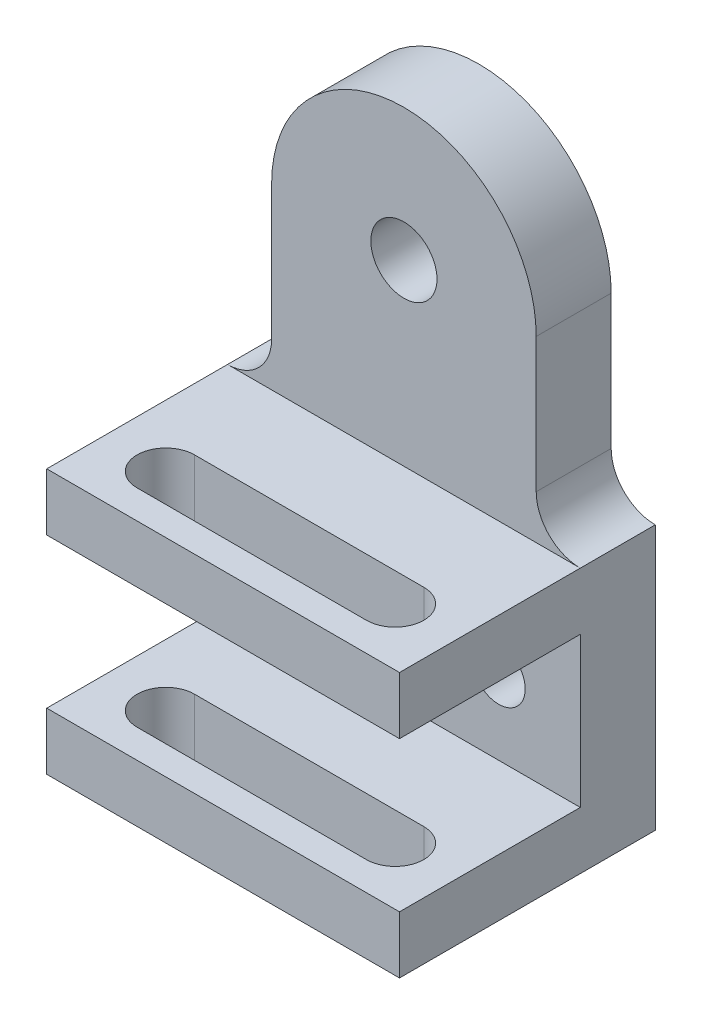
ISO-10303-21;
HEADER;
FILE_DESCRIPTION(('STEP AP214'),'2;1');
FILE_NAME('part.step','',(''),(''),'','','');
FILE_SCHEMA(('AUTOMOTIVE_DESIGN { 1 0 10303 214 1 1 1 1 }'));
ENDSEC;
DATA;
#1=APPLICATION_CONTEXT('core data for automotive mechanical design processes');
#2=APPLICATION_PROTOCOL_DEFINITION('international standard','automotive_design',2000,#1);
#3=PRODUCT_CONTEXT('',#1,'mechanical');
#4=PRODUCT('Part','Part','',(#3));
#5=PRODUCT_RELATED_PRODUCT_CATEGORY('part','',(#4));
#6=PRODUCT_DEFINITION_FORMATION('','',#4);
#7=PRODUCT_DEFINITION_CONTEXT('part definition',#1,'design');
#8=PRODUCT_DEFINITION('design','',#6,#7);
#9=PRODUCT_DEFINITION_SHAPE('','',#8);
#10=(LENGTH_UNIT() NAMED_UNIT(*) SI_UNIT(.MILLI.,.METRE.));
#11=(NAMED_UNIT(*) PLANE_ANGLE_UNIT() SI_UNIT($,.RADIAN.));
#12=(NAMED_UNIT(*) SI_UNIT($,.STERADIAN.) SOLID_ANGLE_UNIT());
#13=UNCERTAINTY_MEASURE_WITH_UNIT(LENGTH_MEASURE(1.E-05),#10,'distance_accuracy_value','');
#14=(GEOMETRIC_REPRESENTATION_CONTEXT(3) GLOBAL_UNCERTAINTY_ASSIGNED_CONTEXT((#13)) GLOBAL_UNIT_ASSIGNED_CONTEXT((#10,
#11,#12)) REPRESENTATION_CONTEXT('',''));
#15=CARTESIAN_POINT('',(0.,0.,0.));
#16=DIRECTION('',(0.,0.,1.));
#17=DIRECTION('',(1.,0.,0.));
#18=AXIS2_PLACEMENT_3D('',#15,#16,#17);
#19=CARTESIAN_POINT('',(2032.,1778.,431.8));
#20=DIRECTION('',(0.,0.,1.));
#21=DIRECTION('',(1.,0.,0.));
#22=AXIS2_PLACEMENT_3D('',#19,#20,#21);
#23=PLANE('',#22);
#24=CARTESIAN_POINT('',(469.9,762.,431.8));
#25=DIRECTION('',(0.,0.,1.));
#26=DIRECTION('',(1.,0.,0.));
#27=AXIS2_PLACEMENT_3D('',#24,#25,#26);
#28=CIRCLE('',#27,152.4);
#29=CARTESIAN_POINT('',(622.3,762.,431.8));
#30=VERTEX_POINT('',#29);
#31=EDGE_CURVE('E356',#30,#30,#28,.T.);
#32=ORIENTED_EDGE('',*,*,#31,.F.);
#33=EDGE_LOOP('',(#32));
#34=FACE_BOUND('',#33,.T.);
#35=CARTESIAN_POINT('',(1562.1,762.,431.8));
#36=DIRECTION('',(0.,0.,1.));
#37=DIRECTION('',(1.,0.,0.));
#38=AXIS2_PLACEMENT_3D('',#35,#36,#37);
#39=CIRCLE('',#38,152.4);
#40=CARTESIAN_POINT('',(1714.5,762.,431.8));
#41=VERTEX_POINT('',#40);
#42=EDGE_CURVE('E364',#41,#41,#39,.T.);
#43=ORIENTED_EDGE('',*,*,#42,.F.);
#44=EDGE_LOOP('',(#43));
#45=FACE_BOUND('',#44,.T.);
#46=DIRECTION('',(0.,1.,0.));
#47=VECTOR('',#46,1.);
#48=CARTESIAN_POINT('',(2032.,0.,431.8));
#49=LINE('',#48,#47);
#50=CARTESIAN_POINT('',(2032.,330.2,431.8));
#51=VERTEX_POINT('',#50);
#52=CARTESIAN_POINT('',(2032.,1193.8,431.8));
#53=VERTEX_POINT('',#52);
#54=EDGE_CURVE('E374',#51,#53,#49,.T.);
#55=ORIENTED_EDGE('',*,*,#54,.T.);
#56=DIRECTION('',(1.,0.,0.));
#57=VECTOR('',#56,1.);
#58=CARTESIAN_POINT('',(2032.,1193.8,431.8));
#59=LINE('',#58,#57);
#60=CARTESIAN_POINT('',(0.,1193.8,431.8));
#61=VERTEX_POINT('',#60);
#62=EDGE_CURVE('E305',#61,#53,#59,.T.);
#63=ORIENTED_EDGE('',*,*,#62,.F.);
#64=DIRECTION('',(0.,-1.,0.));
#65=VECTOR('',#64,1.);
#66=CARTESIAN_POINT('',(0.,1524.,431.8));
#67=LINE('',#66,#65);
#68=CARTESIAN_POINT('',(0.,330.2,431.8));
#69=VERTEX_POINT('',#68);
#70=EDGE_CURVE('E371',#61,#69,#67,.T.);
#71=ORIENTED_EDGE('',*,*,#70,.T.);
#72=DIRECTION('',(-1.,0.,0.));
#73=VECTOR('',#72,1.);
#74=CARTESIAN_POINT('',(2032.,330.2,431.8));
#75=LINE('',#74,#73);
#76=EDGE_CURVE('E309',#51,#69,#75,.T.);
#77=ORIENTED_EDGE('',*,*,#76,.F.);
#78=EDGE_LOOP('',(#55,#63,#71,#77));
#79=FACE_BOUND('',#78,.T.);
#80=ADVANCED_FACE('F56',(#34,#45,#79),#23,.T.);
#81=CARTESIAN_POINT('',(1016.,2552.7,431.8));
#82=DIRECTION('',(0.,0.,1.));
#83=DIRECTION('',(1.,0.,0.));
#84=AXIS2_PLACEMENT_3D('',#81,#82,#83);
#85=CIRCLE('',#84,190.5);
#86=CARTESIAN_POINT('',(1206.5,2552.7,431.8));
#87=VERTEX_POINT('',#86);
#88=EDGE_CURVE('E352',#87,#87,#85,.T.);
#89=ORIENTED_EDGE('',*,*,#88,.F.);
#90=EDGE_LOOP('',(#89));
#91=FACE_BOUND('',#90,.T.);
#92=CARTESIAN_POINT('',(1.11022302462516E-13,1778.,431.8));
#93=DIRECTION('',(0.,0.,-1.));
#94=DIRECTION('',(1.,0.,0.));
#95=AXIS2_PLACEMENT_3D('',#92,#93,#94);
#96=CIRCLE('',#95,254.);
#97=CARTESIAN_POINT('',(254.,1778.,431.8));
#98=VERTEX_POINT('',#97);
#99=CARTESIAN_POINT('',(0.,1524.,431.8));
#100=VERTEX_POINT('',#99);
#101=EDGE_CURVE('E391',#98,#100,#96,.T.);
#102=ORIENTED_EDGE('',*,*,#101,.T.);
#103=DIRECTION('',(-1.,0.,0.));
#104=VECTOR('',#103,1.);
#105=CARTESIAN_POINT('',(0.,1524.,431.8));
#106=LINE('',#105,#104);
#107=CARTESIAN_POINT('',(2032.,1524.,431.8));
#108=VERTEX_POINT('',#107);
#109=EDGE_CURVE('E302',#108,#100,#106,.T.);
#110=ORIENTED_EDGE('',*,*,#109,.F.);
#111=CARTESIAN_POINT('',(2032.,1778.,431.8));
#112=DIRECTION('',(0.,0.,-1.));
#113=DIRECTION('',(1.,0.,0.));
#114=AXIS2_PLACEMENT_3D('',#111,#112,#113);
#115=CIRCLE('',#114,254.);
#116=CARTESIAN_POINT('',(1778.,1778.,431.8));
#117=VERTEX_POINT('',#116);
#118=EDGE_CURVE('E379',#108,#117,#115,.T.);
#119=ORIENTED_EDGE('',*,*,#118,.T.);
#120=DIRECTION('',(0.,1.,0.));
#121=VECTOR('',#120,1.);
#122=CARTESIAN_POINT('',(1778.,2552.7,431.8));
#123=LINE('',#122,#121);
#124=CARTESIAN_POINT('',(1778.,2552.7,431.8));
#125=VERTEX_POINT('',#124);
#126=EDGE_CURVE('E382',#117,#125,#123,.T.);
#127=ORIENTED_EDGE('',*,*,#126,.T.);
#128=CARTESIAN_POINT('',(1016.,2552.7,431.8));
#129=DIRECTION('',(0.,0.,1.));
#130=DIRECTION('',(1.,0.,0.));
#131=AXIS2_PLACEMENT_3D('',#128,#129,#130);
#132=CIRCLE('',#131,762.);
#133=CARTESIAN_POINT('',(254.,2552.7,431.8));
#134=VERTEX_POINT('',#133);
#135=EDGE_CURVE('E385',#125,#134,#132,.T.);
#136=ORIENTED_EDGE('',*,*,#135,.T.);
#137=DIRECTION('',(0.,-1.,0.));
#138=VECTOR('',#137,1.);
#139=CARTESIAN_POINT('',(254.,2552.7,431.8));
#140=LINE('',#139,#138);
#141=EDGE_CURVE('E388',#134,#98,#140,.T.);
#142=ORIENTED_EDGE('',*,*,#141,.T.);
#143=EDGE_LOOP('',(#102,#110,#119,#127,#136,#142));
#144=FACE_BOUND('',#143,.T.);
#145=ADVANCED_FACE('F468',(#91,#144),#23,.T.);
#146=CARTESIAN_POINT('',(0.,1524.,431.8));
#147=DIRECTION('',(1.,0.,0.));
#148=DIRECTION('',(0.,1.,0.));
#149=AXIS2_PLACEMENT_3D('',#146,#147,#148);
#150=PLANE('',#149);
#151=DIRECTION('',(0.,-1.,0.));
#152=VECTOR('',#151,1.);
#153=CARTESIAN_POINT('',(0.,1524.,0.));
#154=LINE('',#153,#152);
#155=CARTESIAN_POINT('',(0.,1524.,0.));
#156=VERTEX_POINT('',#155);
#157=CARTESIAN_POINT('',(0.,0.,0.));
#158=VERTEX_POINT('',#157);
#159=EDGE_CURVE('E351',#156,#158,#154,.T.);
#160=ORIENTED_EDGE('',*,*,#159,.T.);
#161=DIRECTION('',(0.,0.,-1.));
#162=VECTOR('',#161,1.);
#163=CARTESIAN_POINT('',(0.,0.,431.8));
#164=LINE('',#163,#162);
#165=CARTESIAN_POINT('',(0.,0.,1473.2));
#166=VERTEX_POINT('',#165);
#167=EDGE_CURVE('E13',#166,#158,#164,.T.);
#168=ORIENTED_EDGE('',*,*,#167,.F.);
#169=DIRECTION('',(0.,-1.,0.));
#170=VECTOR('',#169,1.);
#171=CARTESIAN_POINT('',(0.,330.2,1473.2));
#172=LINE('',#171,#170);
#173=CARTESIAN_POINT('',(0.,330.2,1473.2));
#174=VERTEX_POINT('',#173);
#175=EDGE_CURVE('E321',#174,#166,#172,.T.);
#176=ORIENTED_EDGE('',*,*,#175,.F.);
#177=DIRECTION('',(0.,0.,-1.));
#178=VECTOR('',#177,1.);
#179=CARTESIAN_POINT('',(0.,330.2,1473.2));
#180=LINE('',#179,#178);
#181=EDGE_CURVE('E335',#174,#69,#180,.T.);
#182=ORIENTED_EDGE('',*,*,#181,.T.);
#183=ORIENTED_EDGE('',*,*,#70,.F.);
#184=DIRECTION('',(0.,0.,-1.));
#185=VECTOR('',#184,1.);
#186=CARTESIAN_POINT('',(0.,1193.8,1473.2));
#187=LINE('',#186,#185);
#188=CARTESIAN_POINT('',(0.,1193.8,1473.2));
#189=VERTEX_POINT('',#188);
#190=EDGE_CURVE('E287',#189,#61,#187,.T.);
#191=ORIENTED_EDGE('',*,*,#190,.F.);
#192=DIRECTION('',(0.,-1.,0.));
#193=VECTOR('',#192,1.);
#194=CARTESIAN_POINT('',(0.,1193.8,1473.2));
#195=LINE('',#194,#193);
#196=CARTESIAN_POINT('',(0.,1524.,1473.2));
#197=VERTEX_POINT('',#196);
#198=EDGE_CURVE('E306',#197,#189,#195,.T.);
#199=ORIENTED_EDGE('',*,*,#198,.F.);
#200=DIRECTION('',(0.,0.,-1.));
#201=VECTOR('',#200,1.);
#202=CARTESIAN_POINT('',(0.,1524.,1473.2));
#203=LINE('',#202,#201);
#204=EDGE_CURVE('E297',#197,#100,#203,.T.);
#205=ORIENTED_EDGE('',*,*,#204,.T.);
#206=DIRECTION('',(0.,0.,-1.));
#207=VECTOR('',#206,1.);
#208=CARTESIAN_POINT('',(0.,1524.,431.8));
#209=LINE('',#208,#207);
#210=EDGE_CURVE('E395',#100,#156,#209,.T.);
#211=ORIENTED_EDGE('',*,*,#210,.T.);
#212=EDGE_LOOP('',(#160,#168,#176,#182,#183,#191,#199,#205,#211));
#213=FACE_BOUND('',#212,.T.);
#214=ADVANCED_FACE('F58',(#213),#150,.F.);
#215=CARTESIAN_POINT('',(0.,0.,431.8));
#216=DIRECTION('',(0.,1.,0.));
#217=DIRECTION('',(0.,0.,1.));
#218=AXIS2_PLACEMENT_3D('',#215,#216,#217);
#219=PLANE('',#218);
#220=DIRECTION('',(-1.,0.,0.));
#221=VECTOR('',#220,1.);
#222=CARTESIAN_POINT('',(355.6,-2.22044604925031E-13,977.9));
#223=LINE('',#222,#221);
#224=CARTESIAN_POINT('',(1676.4,0.,977.9));
#225=VERTEX_POINT('',#224);
#226=CARTESIAN_POINT('',(355.6,-2.22044604925031E-13,977.9));
#227=VERTEX_POINT('',#226);
#228=EDGE_CURVE('E222',#225,#227,#223,.T.);
#229=ORIENTED_EDGE('',*,*,#228,.T.);
#230=CARTESIAN_POINT('',(355.6,-2.22044604925031E-13,1143.));
#231=DIRECTION('',(0.,1.,0.));
#232=DIRECTION('',(-1.,0.,0.));
#233=AXIS2_PLACEMENT_3D('',#230,#231,#232);
#234=CIRCLE('',#233,165.1);
#235=CARTESIAN_POINT('',(355.6,-2.22044604925031E-13,1308.1));
#236=VERTEX_POINT('',#235);
#237=EDGE_CURVE('E203',#227,#236,#234,.T.);
#238=ORIENTED_EDGE('',*,*,#237,.T.);
#239=DIRECTION('',(1.,0.,0.));
#240=VECTOR('',#239,1.);
#241=CARTESIAN_POINT('',(355.6,-2.22044604925031E-13,1308.1));
#242=LINE('',#241,#240);
#243=CARTESIAN_POINT('',(1676.4,0.,1308.1));
#244=VERTEX_POINT('',#243);
#245=EDGE_CURVE('E213',#236,#244,#242,.T.);
#246=ORIENTED_EDGE('',*,*,#245,.T.);
#247=CARTESIAN_POINT('',(1676.4,0.,1143.));
#248=DIRECTION('',(0.,1.,0.));
#249=DIRECTION('',(-1.,0.,0.));
#250=AXIS2_PLACEMENT_3D('',#247,#248,#249);
#251=CIRCLE('',#250,165.1);
#252=EDGE_CURVE('E72',#244,#225,#251,.T.);
#253=ORIENTED_EDGE('',*,*,#252,.T.);
#254=EDGE_LOOP('',(#229,#238,#246,#253));
#255=FACE_BOUND('',#254,.T.);
#256=DIRECTION('',(1.,0.,0.));
#257=VECTOR('',#256,1.);
#258=CARTESIAN_POINT('',(0.,0.,0.));
#259=LINE('',#258,#257);
#260=CARTESIAN_POINT('',(2032.,0.,0.));
#261=VERTEX_POINT('',#260);
#262=EDGE_CURVE('E399',#158,#261,#259,.T.);
#263=ORIENTED_EDGE('',*,*,#262,.T.);
#264=DIRECTION('',(0.,0.,-1.));
#265=VECTOR('',#264,1.);
#266=CARTESIAN_POINT('',(2032.,0.,431.8));
#267=LINE('',#266,#265);
#268=CARTESIAN_POINT('',(2032.,0.,1473.2));
#269=VERTEX_POINT('',#268);
#270=EDGE_CURVE('E65',#269,#261,#267,.T.);
#271=ORIENTED_EDGE('',*,*,#270,.F.);
#272=DIRECTION('',(1.,0.,0.));
#273=VECTOR('',#272,1.);
#274=CARTESIAN_POINT('',(0.,0.,1473.2));
#275=LINE('',#274,#273);
#276=EDGE_CURVE('E325',#166,#269,#275,.T.);
#277=ORIENTED_EDGE('',*,*,#276,.F.);
#278=ORIENTED_EDGE('',*,*,#167,.T.);
#279=EDGE_LOOP('',(#263,#271,#277,#278));
#280=FACE_BOUND('',#279,.T.);
#281=ADVANCED_FACE('F219',(#255,#280),#219,.F.);
#282=CARTESIAN_POINT('',(2032.,0.,431.8));
#283=DIRECTION('',(-1.,0.,0.));
#284=DIRECTION('',(0.,0.,1.));
#285=AXIS2_PLACEMENT_3D('',#282,#283,#284);
#286=PLANE('',#285);
#287=DIRECTION('',(0.,1.,0.));
#288=VECTOR('',#287,1.);
#289=CARTESIAN_POINT('',(2032.,0.,0.));
#290=LINE('',#289,#288);
#291=CARTESIAN_POINT('',(2032.,1524.,0.));
#292=VERTEX_POINT('',#291);
#293=EDGE_CURVE('E402',#261,#292,#290,.T.);
#294=ORIENTED_EDGE('',*,*,#293,.T.);
#295=DIRECTION('',(0.,0.,-1.));
#296=VECTOR('',#295,1.);
#297=CARTESIAN_POINT('',(2032.,1524.,431.8));
#298=LINE('',#297,#296);
#299=EDGE_CURVE('E438',#108,#292,#298,.T.);
#300=ORIENTED_EDGE('',*,*,#299,.F.);
#301=DIRECTION('',(0.,0.,-1.));
#302=VECTOR('',#301,1.);
#303=CARTESIAN_POINT('',(2032.,1524.,1473.2));
#304=LINE('',#303,#302);
#305=CARTESIAN_POINT('',(2032.,1524.,1473.2));
#306=VERTEX_POINT('',#305);
#307=EDGE_CURVE('E294',#306,#108,#304,.T.);
#308=ORIENTED_EDGE('',*,*,#307,.F.);
#309=DIRECTION('',(0.,1.,0.));
#310=VECTOR('',#309,1.);
#311=CARTESIAN_POINT('',(2032.,1524.,1473.2));
#312=LINE('',#311,#310);
#313=CARTESIAN_POINT('',(2032.,1193.8,1473.2));
#314=VERTEX_POINT('',#313);
#315=EDGE_CURVE('E312',#314,#306,#312,.T.);
#316=ORIENTED_EDGE('',*,*,#315,.F.);
#317=DIRECTION('',(0.,0.,-1.));
#318=VECTOR('',#317,1.);
#319=CARTESIAN_POINT('',(2032.,1193.8,1473.2));
#320=LINE('',#319,#318);
#321=EDGE_CURVE('E290',#314,#53,#320,.T.);
#322=ORIENTED_EDGE('',*,*,#321,.T.);
#323=ORIENTED_EDGE('',*,*,#54,.F.);
#324=DIRECTION('',(0.,0.,-1.));
#325=VECTOR('',#324,1.);
#326=CARTESIAN_POINT('',(2032.,330.2,1473.2));
#327=LINE('',#326,#325);
#328=CARTESIAN_POINT('',(2032.,330.2,1473.2));
#329=VERTEX_POINT('',#328);
#330=EDGE_CURVE('E342',#329,#51,#327,.T.);
#331=ORIENTED_EDGE('',*,*,#330,.F.);
#332=DIRECTION('',(0.,1.,0.));
#333=VECTOR('',#332,1.);
#334=CARTESIAN_POINT('',(2032.,0.,1473.2));
#335=LINE('',#334,#333);
#336=EDGE_CURVE('E329',#269,#329,#335,.T.);
#337=ORIENTED_EDGE('',*,*,#336,.F.);
#338=ORIENTED_EDGE('',*,*,#270,.T.);
#339=EDGE_LOOP('',(#294,#300,#308,#316,#322,#323,#331,#337,#338));
#340=FACE_BOUND('',#339,.T.);
#341=ADVANCED_FACE('F448',(#340),#286,.F.);
#342=CARTESIAN_POINT('',(2032.,1778.,431.8));
#343=DIRECTION('',(0.,0.,-1.));
#344=DIRECTION('',(-1.,0.,0.));
#345=AXIS2_PLACEMENT_3D('',#342,#343,#344);
#346=CYLINDRICAL_SURFACE('',#345,254.);
#347=CARTESIAN_POINT('',(2032.,1778.,0.));
#348=DIRECTION('',(0.,0.,-1.));
#349=DIRECTION('',(1.,0.,0.));
#350=AXIS2_PLACEMENT_3D('',#347,#348,#349);
#351=CIRCLE('',#350,254.);
#352=CARTESIAN_POINT('',(1778.,1778.,0.));
#353=VERTEX_POINT('',#352);
#354=EDGE_CURVE('E405',#292,#353,#351,.T.);
#355=ORIENTED_EDGE('',*,*,#354,.T.);
#356=DIRECTION('',(0.,0.,-1.));
#357=VECTOR('',#356,1.);
#358=CARTESIAN_POINT('',(1778.,1778.,431.8));
#359=LINE('',#358,#357);
#360=EDGE_CURVE('E434',#117,#353,#359,.T.);
#361=ORIENTED_EDGE('',*,*,#360,.F.);
#362=ORIENTED_EDGE('',*,*,#118,.F.);
#363=ORIENTED_EDGE('',*,*,#299,.T.);
#364=EDGE_LOOP('',(#355,#361,#362,#363));
#365=FACE_BOUND('',#364,.T.);
#366=ADVANCED_FACE('F460',(#365),#346,.F.);
#367=CARTESIAN_POINT('',(1778.,2552.7,431.8));
#368=DIRECTION('',(-1.,0.,0.));
#369=DIRECTION('',(0.,0.,1.));
#370=AXIS2_PLACEMENT_3D('',#367,#368,#369);
#371=PLANE('',#370);
#372=DIRECTION('',(0.,1.,0.));
#373=VECTOR('',#372,1.);
#374=CARTESIAN_POINT('',(1778.,2552.7,0.));
#375=LINE('',#374,#373);
#376=CARTESIAN_POINT('',(1778.,2552.7,0.));
#377=VERTEX_POINT('',#376);
#378=EDGE_CURVE('E408',#353,#377,#375,.T.);
#379=ORIENTED_EDGE('',*,*,#378,.T.);
#380=DIRECTION('',(0.,0.,-1.));
#381=VECTOR('',#380,1.);
#382=CARTESIAN_POINT('',(1778.,2552.7,431.8));
#383=LINE('',#382,#381);
#384=EDGE_CURVE('E430',#125,#377,#383,.T.);
#385=ORIENTED_EDGE('',*,*,#384,.F.);
#386=ORIENTED_EDGE('',*,*,#126,.F.);
#387=ORIENTED_EDGE('',*,*,#360,.T.);
#388=EDGE_LOOP('',(#379,#385,#386,#387));
#389=FACE_BOUND('',#388,.T.);
#390=ADVANCED_FACE('F464',(#389),#371,.F.);
#391=CARTESIAN_POINT('',(1016.,2552.7,431.8));
#392=DIRECTION('',(0.,0.,-1.));
#393=DIRECTION('',(-1.,0.,0.));
#394=AXIS2_PLACEMENT_3D('',#391,#392,#393);
#395=CYLINDRICAL_SURFACE('',#394,762.);
#396=CARTESIAN_POINT('',(1016.,2552.7,0.));
#397=DIRECTION('',(0.,0.,1.));
#398=DIRECTION('',(1.,0.,0.));
#399=AXIS2_PLACEMENT_3D('',#396,#397,#398);
#400=CIRCLE('',#399,762.);
#401=CARTESIAN_POINT('',(254.,2552.7,0.));
#402=VERTEX_POINT('',#401);
#403=EDGE_CURVE('E411',#377,#402,#400,.T.);
#404=ORIENTED_EDGE('',*,*,#403,.T.);
#405=DIRECTION('',(0.,0.,-1.));
#406=VECTOR('',#405,1.);
#407=CARTESIAN_POINT('',(254.,2552.7,431.8));
#408=LINE('',#407,#406);
#409=EDGE_CURVE('E426',#134,#402,#408,.T.);
#410=ORIENTED_EDGE('',*,*,#409,.F.);
#411=ORIENTED_EDGE('',*,*,#135,.F.);
#412=ORIENTED_EDGE('',*,*,#384,.T.);
#413=EDGE_LOOP('',(#404,#410,#411,#412));
#414=FACE_BOUND('',#413,.T.);
#415=ADVANCED_FACE('F507',(#414),#395,.T.);
#416=CARTESIAN_POINT('',(254.,2552.7,431.8));
#417=DIRECTION('',(1.,0.,0.));
#418=DIRECTION('',(0.,0.,-1.));
#419=AXIS2_PLACEMENT_3D('',#416,#417,#418);
#420=PLANE('',#419);
#421=DIRECTION('',(0.,-1.,0.));
#422=VECTOR('',#421,1.);
#423=CARTESIAN_POINT('',(254.,2552.7,0.));
#424=LINE('',#423,#422);
#425=CARTESIAN_POINT('',(254.,1778.,0.));
#426=VERTEX_POINT('',#425);
#427=EDGE_CURVE('E414',#402,#426,#424,.T.);
#428=ORIENTED_EDGE('',*,*,#427,.T.);
#429=DIRECTION('',(0.,0.,-1.));
#430=VECTOR('',#429,1.);
#431=CARTESIAN_POINT('',(254.,1778.,431.8));
#432=LINE('',#431,#430);
#433=EDGE_CURVE('E422',#98,#426,#432,.T.);
#434=ORIENTED_EDGE('',*,*,#433,.F.);
#435=ORIENTED_EDGE('',*,*,#141,.F.);
#436=ORIENTED_EDGE('',*,*,#409,.T.);
#437=EDGE_LOOP('',(#428,#434,#435,#436));
#438=FACE_BOUND('',#437,.T.);
#439=ADVANCED_FACE('F505',(#438),#420,.F.);
#440=CARTESIAN_POINT('',(1.11022302462516E-13,1778.,431.8));
#441=DIRECTION('',(0.,0.,-1.));
#442=DIRECTION('',(-1.,0.,0.));
#443=AXIS2_PLACEMENT_3D('',#440,#441,#442);
#444=CYLINDRICAL_SURFACE('',#443,254.);
#445=CARTESIAN_POINT('',(1.11022302462516E-13,1778.,0.));
#446=DIRECTION('',(0.,0.,-1.));
#447=DIRECTION('',(1.,0.,0.));
#448=AXIS2_PLACEMENT_3D('',#445,#446,#447);
#449=CIRCLE('',#448,254.);
#450=EDGE_CURVE('E375',#426,#156,#449,.T.);
#451=ORIENTED_EDGE('',*,*,#450,.T.);
#452=ORIENTED_EDGE('',*,*,#210,.F.);
#453=ORIENTED_EDGE('',*,*,#101,.F.);
#454=ORIENTED_EDGE('',*,*,#433,.T.);
#455=EDGE_LOOP('',(#451,#452,#453,#454));
#456=FACE_BOUND('',#455,.T.);
#457=ADVANCED_FACE('F501',(#456),#444,.F.);
#458=CARTESIAN_POINT('',(2032.,1778.,0.));
#459=DIRECTION('',(0.,0.,1.));
#460=DIRECTION('',(1.,0.,0.));
#461=AXIS2_PLACEMENT_3D('',#458,#459,#460);
#462=PLANE('',#461);
#463=CARTESIAN_POINT('',(1016.,2552.7,0.));
#464=DIRECTION('',(0.,0.,1.));
#465=DIRECTION('',(1.,0.,0.));
#466=AXIS2_PLACEMENT_3D('',#463,#464,#465);
#467=CIRCLE('',#466,190.5);
#468=CARTESIAN_POINT('',(1206.5,2552.7,0.));
#469=VERTEX_POINT('',#468);
#470=EDGE_CURVE('E347',#469,#469,#467,.T.);
#471=ORIENTED_EDGE('',*,*,#470,.T.);
#472=EDGE_LOOP('',(#471));
#473=FACE_BOUND('',#472,.T.);
#474=CARTESIAN_POINT('',(469.9,762.,0.));
#475=DIRECTION('',(0.,0.,1.));
#476=DIRECTION('',(1.,0.,0.));
#477=AXIS2_PLACEMENT_3D('',#474,#475,#476);
#478=CIRCLE('',#477,152.4);
#479=CARTESIAN_POINT('',(622.3,762.,0.));
#480=VERTEX_POINT('',#479);
#481=EDGE_CURVE('E360',#480,#480,#478,.T.);
#482=ORIENTED_EDGE('',*,*,#481,.T.);
#483=EDGE_LOOP('',(#482));
#484=FACE_BOUND('',#483,.T.);
#485=CARTESIAN_POINT('',(1562.1,762.,0.));
#486=DIRECTION('',(0.,0.,1.));
#487=DIRECTION('',(1.,0.,0.));
#488=AXIS2_PLACEMENT_3D('',#485,#486,#487);
#489=CIRCLE('',#488,152.4);
#490=CARTESIAN_POINT('',(1714.5,762.,0.));
#491=VERTEX_POINT('',#490);
#492=EDGE_CURVE('E346',#491,#491,#489,.T.);
#493=ORIENTED_EDGE('',*,*,#492,.T.);
#494=EDGE_LOOP('',(#493));
#495=FACE_BOUND('',#494,.T.);
#496=ORIENTED_EDGE('',*,*,#159,.F.);
#497=ORIENTED_EDGE('',*,*,#450,.F.);
#498=ORIENTED_EDGE('',*,*,#427,.F.);
#499=ORIENTED_EDGE('',*,*,#403,.F.);
#500=ORIENTED_EDGE('',*,*,#378,.F.);
#501=ORIENTED_EDGE('',*,*,#354,.F.);
#502=ORIENTED_EDGE('',*,*,#293,.F.);
#503=ORIENTED_EDGE('',*,*,#262,.F.);
#504=EDGE_LOOP('',(#496,#497,#498,#499,#500,#501,#502,#503));
#505=FACE_BOUND('',#504,.T.);
#506=ADVANCED_FACE('F455',(#473,#484,#495,#505),#462,.F.);
#507=CARTESIAN_POINT('',(1562.1,762.,0.));
#508=DIRECTION('',(0.,0.,1.));
#509=DIRECTION('',(1.,0.,0.));
#510=AXIS2_PLACEMENT_3D('',#507,#508,#509);
#511=CYLINDRICAL_SURFACE('',#510,152.4);
#512=ORIENTED_EDGE('',*,*,#492,.F.);
#513=EDGE_LOOP('',(#512));
#514=FACE_BOUND('',#513,.T.);
#515=ORIENTED_EDGE('',*,*,#42,.T.);
#516=EDGE_LOOP('',(#515));
#517=FACE_BOUND('',#516,.T.);
#518=ADVANCED_FACE('F527',(#514,#517),#511,.F.);
#519=CARTESIAN_POINT('',(469.9,762.,0.));
#520=DIRECTION('',(0.,0.,1.));
#521=DIRECTION('',(1.,0.,0.));
#522=AXIS2_PLACEMENT_3D('',#519,#520,#521);
#523=CYLINDRICAL_SURFACE('',#522,152.4);
#524=ORIENTED_EDGE('',*,*,#481,.F.);
#525=EDGE_LOOP('',(#524));
#526=FACE_BOUND('',#525,.T.);
#527=ORIENTED_EDGE('',*,*,#31,.T.);
#528=EDGE_LOOP('',(#527));
#529=FACE_BOUND('',#528,.T.);
#530=ADVANCED_FACE('F549',(#526,#529),#523,.F.);
#531=CARTESIAN_POINT('',(1016.,2552.7,0.));
#532=DIRECTION('',(0.,0.,1.));
#533=DIRECTION('',(1.,0.,0.));
#534=AXIS2_PLACEMENT_3D('',#531,#532,#533);
#535=CYLINDRICAL_SURFACE('',#534,190.5);
#536=ORIENTED_EDGE('',*,*,#470,.F.);
#537=EDGE_LOOP('',(#536));
#538=FACE_BOUND('',#537,.T.);
#539=ORIENTED_EDGE('',*,*,#88,.T.);
#540=EDGE_LOOP('',(#539));
#541=FACE_BOUND('',#540,.T.);
#542=ADVANCED_FACE('F556',(#538,#541),#535,.F.);
#543=CARTESIAN_POINT('',(2032.,330.2,1473.2));
#544=DIRECTION('',(0.,-1.,0.));
#545=DIRECTION('',(1.,0.,0.));
#546=AXIS2_PLACEMENT_3D('',#543,#544,#545);
#547=PLANE('',#546);
#548=DIRECTION('',(-1.,0.,0.));
#549=VECTOR('',#548,1.);
#550=CARTESIAN_POINT('',(2032.,330.2,1308.1));
#551=LINE('',#550,#549);
#552=CARTESIAN_POINT('',(1676.4,330.2,1308.1));
#553=VERTEX_POINT('',#552);
#554=CARTESIAN_POINT('',(355.6,330.2,1308.1));
#555=VERTEX_POINT('',#554);
#556=EDGE_CURVE('E262',#553,#555,#551,.T.);
#557=ORIENTED_EDGE('',*,*,#556,.T.);
#558=CARTESIAN_POINT('',(355.6,330.2,1143.));
#559=DIRECTION('',(0.,-1.,0.));
#560=DIRECTION('',(1.,0.,0.));
#561=AXIS2_PLACEMENT_3D('',#558,#559,#560);
#562=CIRCLE('',#561,165.1);
#563=CARTESIAN_POINT('',(355.6,330.2,977.9));
#564=VERTEX_POINT('',#563);
#565=EDGE_CURVE('E206',#555,#564,#562,.T.);
#566=ORIENTED_EDGE('',*,*,#565,.T.);
#567=DIRECTION('',(1.,0.,0.));
#568=VECTOR('',#567,1.);
#569=CARTESIAN_POINT('',(2032.,330.2,977.9));
#570=LINE('',#569,#568);
#571=CARTESIAN_POINT('',(1676.4,330.2,977.9));
#572=VERTEX_POINT('',#571);
#573=EDGE_CURVE('E277',#564,#572,#570,.T.);
#574=ORIENTED_EDGE('',*,*,#573,.T.);
#575=CARTESIAN_POINT('',(1676.4,330.2,1143.));
#576=DIRECTION('',(0.,-1.,0.));
#577=DIRECTION('',(1.,0.,0.));
#578=AXIS2_PLACEMENT_3D('',#575,#576,#577);
#579=CIRCLE('',#578,165.1);
#580=EDGE_CURVE('E269',#572,#553,#579,.T.);
#581=ORIENTED_EDGE('',*,*,#580,.T.);
#582=EDGE_LOOP('',(#557,#566,#574,#581));
#583=FACE_BOUND('',#582,.T.);
#584=ORIENTED_EDGE('',*,*,#76,.T.);
#585=ORIENTED_EDGE('',*,*,#181,.F.);
#586=DIRECTION('',(-1.,0.,0.));
#587=VECTOR('',#586,1.);
#588=CARTESIAN_POINT('',(2032.,330.2,1473.2));
#589=LINE('',#588,#587);
#590=EDGE_CURVE('E332',#329,#174,#589,.T.);
#591=ORIENTED_EDGE('',*,*,#590,.F.);
#592=ORIENTED_EDGE('',*,*,#330,.T.);
#593=EDGE_LOOP('',(#584,#585,#591,#592));
#594=FACE_BOUND('',#593,.T.);
#595=ADVANCED_FACE('F492',(#583,#594),#547,.F.);
#596=CARTESIAN_POINT('',(0.,0.,1473.2));
#597=DIRECTION('',(0.,0.,1.));
#598=DIRECTION('',(1.,0.,0.));
#599=AXIS2_PLACEMENT_3D('',#596,#597,#598);
#600=PLANE('',#599);
#601=ORIENTED_EDGE('',*,*,#175,.T.);
#602=ORIENTED_EDGE('',*,*,#276,.T.);
#603=ORIENTED_EDGE('',*,*,#336,.T.);
#604=ORIENTED_EDGE('',*,*,#590,.T.);
#605=EDGE_LOOP('',(#601,#602,#603,#604));
#606=FACE_BOUND('',#605,.T.);
#607=ADVANCED_FACE('F497',(#606),#600,.T.);
#608=CARTESIAN_POINT('',(2032.,1193.8,1473.2));
#609=DIRECTION('',(0.,1.,0.));
#610=DIRECTION('',(0.,0.,1.));
#611=AXIS2_PLACEMENT_3D('',#608,#609,#610);
#612=PLANE('',#611);
#613=DIRECTION('',(-1.,0.,0.));
#614=VECTOR('',#613,1.);
#615=CARTESIAN_POINT('',(2032.,1193.8,977.9));
#616=LINE('',#615,#614);
#617=CARTESIAN_POINT('',(1676.4,1193.8,977.9));
#618=VERTEX_POINT('',#617);
#619=CARTESIAN_POINT('',(355.6,1193.8,977.9));
#620=VERTEX_POINT('',#619);
#621=EDGE_CURVE('E273',#618,#620,#616,.T.);
#622=ORIENTED_EDGE('',*,*,#621,.T.);
#623=CARTESIAN_POINT('',(355.6,1193.8,1143.));
#624=DIRECTION('',(0.,1.,0.));
#625=DIRECTION('',(0.,0.,1.));
#626=AXIS2_PLACEMENT_3D('',#623,#624,#625);
#627=CIRCLE('',#626,165.1);
#628=CARTESIAN_POINT('',(355.6,1193.8,1308.1));
#629=VERTEX_POINT('',#628);
#630=EDGE_CURVE('E281',#620,#629,#627,.T.);
#631=ORIENTED_EDGE('',*,*,#630,.T.);
#632=DIRECTION('',(1.,0.,0.));
#633=VECTOR('',#632,1.);
#634=CARTESIAN_POINT('',(2032.,1193.8,1308.1));
#635=LINE('',#634,#633);
#636=CARTESIAN_POINT('',(1676.4,1193.8,1308.1));
#637=VERTEX_POINT('',#636);
#638=EDGE_CURVE('E250',#629,#637,#635,.T.);
#639=ORIENTED_EDGE('',*,*,#638,.T.);
#640=CARTESIAN_POINT('',(1676.4,1193.8,1143.));
#641=DIRECTION('',(0.,1.,0.));
#642=DIRECTION('',(0.,0.,1.));
#643=AXIS2_PLACEMENT_3D('',#640,#641,#642);
#644=CIRCLE('',#643,165.1);
#645=EDGE_CURVE('E265',#637,#618,#644,.T.);
#646=ORIENTED_EDGE('',*,*,#645,.T.);
#647=EDGE_LOOP('',(#622,#631,#639,#646));
#648=FACE_BOUND('',#647,.T.);
#649=ORIENTED_EDGE('',*,*,#62,.T.);
#650=ORIENTED_EDGE('',*,*,#321,.F.);
#651=DIRECTION('',(1.,0.,0.));
#652=VECTOR('',#651,1.);
#653=CARTESIAN_POINT('',(2032.,1193.8,1473.2));
#654=LINE('',#653,#652);
#655=EDGE_CURVE('E315',#189,#314,#654,.T.);
#656=ORIENTED_EDGE('',*,*,#655,.F.);
#657=ORIENTED_EDGE('',*,*,#190,.T.);
#658=EDGE_LOOP('',(#649,#650,#656,#657));
#659=FACE_BOUND('',#658,.T.);
#660=ADVANCED_FACE('F485',(#648,#659),#612,.F.);
#661=CARTESIAN_POINT('',(0.,1524.,1473.2));
#662=DIRECTION('',(0.,-1.,0.));
#663=DIRECTION('',(1.,0.,0.));
#664=AXIS2_PLACEMENT_3D('',#661,#662,#663);
#665=PLANE('',#664);
#666=DIRECTION('',(1.,0.,0.));
#667=VECTOR('',#666,1.);
#668=CARTESIAN_POINT('',(355.6,1524.,1308.1));
#669=LINE('',#668,#667);
#670=CARTESIAN_POINT('',(355.6,1524.,1308.1));
#671=VERTEX_POINT('',#670);
#672=CARTESIAN_POINT('',(1676.4,1524.,1308.1));
#673=VERTEX_POINT('',#672);
#674=EDGE_CURVE('E240',#671,#673,#669,.T.);
#675=ORIENTED_EDGE('',*,*,#674,.F.);
#676=CARTESIAN_POINT('',(355.6,1524.,1143.));
#677=DIRECTION('',(0.,1.,0.));
#678=DIRECTION('',(-1.,0.,0.));
#679=AXIS2_PLACEMENT_3D('',#676,#677,#678);
#680=CIRCLE('',#679,165.1);
#681=CARTESIAN_POINT('',(355.6,1524.,977.9));
#682=VERTEX_POINT('',#681);
#683=EDGE_CURVE('E237',#682,#671,#680,.T.);
#684=ORIENTED_EDGE('',*,*,#683,.F.);
#685=DIRECTION('',(-1.,0.,0.));
#686=VECTOR('',#685,1.);
#687=CARTESIAN_POINT('',(355.6,1524.,977.9));
#688=LINE('',#687,#686);
#689=CARTESIAN_POINT('',(1676.4,1524.,977.9));
#690=VERTEX_POINT('',#689);
#691=EDGE_CURVE('E224',#690,#682,#688,.T.);
#692=ORIENTED_EDGE('',*,*,#691,.F.);
#693=CARTESIAN_POINT('',(1676.4,1524.,1143.));
#694=DIRECTION('',(0.,1.,0.));
#695=DIRECTION('',(-1.,0.,0.));
#696=AXIS2_PLACEMENT_3D('',#693,#694,#695);
#697=CIRCLE('',#696,165.1);
#698=EDGE_CURVE('E230',#673,#690,#697,.T.);
#699=ORIENTED_EDGE('',*,*,#698,.F.);
#700=EDGE_LOOP('',(#675,#684,#692,#699));
#701=FACE_BOUND('',#700,.T.);
#702=ORIENTED_EDGE('',*,*,#109,.T.);
#703=ORIENTED_EDGE('',*,*,#204,.F.);
#704=DIRECTION('',(-1.,0.,0.));
#705=VECTOR('',#704,1.);
#706=CARTESIAN_POINT('',(0.,1524.,1473.2));
#707=LINE('',#706,#705);
#708=EDGE_CURVE('E301',#306,#197,#707,.T.);
#709=ORIENTED_EDGE('',*,*,#708,.F.);
#710=ORIENTED_EDGE('',*,*,#307,.T.);
#711=EDGE_LOOP('',(#702,#703,#709,#710));
#712=FACE_BOUND('',#711,.T.);
#713=ADVANCED_FACE('F478',(#701,#712),#665,.F.);
#714=CARTESIAN_POINT('',(0.,0.,1473.2));
#715=DIRECTION('',(0.,0.,-1.));
#716=DIRECTION('',(-1.,0.,0.));
#717=AXIS2_PLACEMENT_3D('',#714,#715,#716);
#718=PLANE('',#717);
#719=ORIENTED_EDGE('',*,*,#198,.T.);
#720=ORIENTED_EDGE('',*,*,#655,.T.);
#721=ORIENTED_EDGE('',*,*,#315,.T.);
#722=ORIENTED_EDGE('',*,*,#708,.T.);
#723=EDGE_LOOP('',(#719,#720,#721,#722));
#724=FACE_BOUND('',#723,.T.);
#725=ADVANCED_FACE('F481',(#724),#718,.F.);
#726=CARTESIAN_POINT('',(355.6,-2.22044604925031E-13,1308.1));
#727=DIRECTION('',(0.,0.,1.));
#728=DIRECTION('',(1.,0.,0.));
#729=AXIS2_PLACEMENT_3D('',#726,#727,#728);
#730=PLANE('',#729);
#731=DIRECTION('',(0.,1.,0.));
#732=VECTOR('',#731,1.);
#733=CARTESIAN_POINT('',(355.6,-2.22044604925031E-13,1308.1));
#734=LINE('',#733,#732);
#735=EDGE_CURVE('E210',#629,#671,#734,.T.);
#736=ORIENTED_EDGE('',*,*,#735,.T.);
#737=ORIENTED_EDGE('',*,*,#674,.T.);
#738=DIRECTION('',(0.,1.,0.));
#739=VECTOR('',#738,1.);
#740=CARTESIAN_POINT('',(1676.4,0.,1308.1));
#741=LINE('',#740,#739);
#742=EDGE_CURVE('E209',#637,#673,#741,.T.);
#743=ORIENTED_EDGE('',*,*,#742,.F.);
#744=ORIENTED_EDGE('',*,*,#638,.F.);
#745=EDGE_LOOP('',(#736,#737,#743,#744));
#746=FACE_BOUND('',#745,.T.);
#747=ADVANCED_FACE('F598',(#746),#730,.F.);
#748=CARTESIAN_POINT('',(1676.4,0.,1143.));
#749=DIRECTION('',(0.,1.,0.));
#750=DIRECTION('',(-1.,0.,0.));
#751=AXIS2_PLACEMENT_3D('',#748,#749,#750);
#752=CYLINDRICAL_SURFACE('',#751,165.1);
#753=ORIENTED_EDGE('',*,*,#742,.T.);
#754=ORIENTED_EDGE('',*,*,#698,.T.);
#755=DIRECTION('',(0.,1.,0.));
#756=VECTOR('',#755,1.);
#757=CARTESIAN_POINT('',(1676.4,0.,977.9));
#758=LINE('',#757,#756);
#759=EDGE_CURVE('E256',#618,#690,#758,.T.);
#760=ORIENTED_EDGE('',*,*,#759,.F.);
#761=ORIENTED_EDGE('',*,*,#645,.F.);
#762=EDGE_LOOP('',(#753,#754,#760,#761));
#763=FACE_BOUND('',#762,.T.);
#764=ADVANCED_FACE('F604',(#763),#752,.F.);
#765=CARTESIAN_POINT('',(355.6,-2.22044604925031E-13,977.9));
#766=DIRECTION('',(0.,0.,-1.));
#767=DIRECTION('',(-1.,0.,0.));
#768=AXIS2_PLACEMENT_3D('',#765,#766,#767);
#769=PLANE('',#768);
#770=ORIENTED_EDGE('',*,*,#759,.T.);
#771=ORIENTED_EDGE('',*,*,#691,.T.);
#772=DIRECTION('',(0.,1.,0.));
#773=VECTOR('',#772,1.);
#774=CARTESIAN_POINT('',(355.6,-2.22044604925031E-13,977.9));
#775=LINE('',#774,#773);
#776=EDGE_CURVE('E251',#620,#682,#775,.T.);
#777=ORIENTED_EDGE('',*,*,#776,.F.);
#778=ORIENTED_EDGE('',*,*,#621,.F.);
#779=EDGE_LOOP('',(#770,#771,#777,#778));
#780=FACE_BOUND('',#779,.T.);
#781=ADVANCED_FACE('F612',(#780),#769,.F.);
#782=CARTESIAN_POINT('',(355.6,-2.22044604925031E-13,1143.));
#783=DIRECTION('',(0.,1.,0.));
#784=DIRECTION('',(-1.,0.,0.));
#785=AXIS2_PLACEMENT_3D('',#782,#783,#784);
#786=CYLINDRICAL_SURFACE('',#785,165.1);
#787=ORIENTED_EDGE('',*,*,#776,.T.);
#788=ORIENTED_EDGE('',*,*,#683,.T.);
#789=ORIENTED_EDGE('',*,*,#735,.F.);
#790=ORIENTED_EDGE('',*,*,#630,.F.);
#791=EDGE_LOOP('',(#787,#788,#789,#790));
#792=FACE_BOUND('',#791,.T.);
#793=ADVANCED_FACE('F621',(#792),#786,.F.);
#794=EDGE_CURVE('E80',#236,#555,#734,.T.);
#795=ORIENTED_EDGE('',*,*,#794,.F.);
#796=ORIENTED_EDGE('',*,*,#237,.F.);
#797=EDGE_CURVE('E247',#227,#564,#775,.T.);
#798=ORIENTED_EDGE('',*,*,#797,.T.);
#799=ORIENTED_EDGE('',*,*,#565,.F.);
#800=EDGE_LOOP('',(#795,#796,#798,#799));
#801=FACE_BOUND('',#800,.T.);
#802=ADVANCED_FACE('F200',(#801),#786,.F.);
#803=ORIENTED_EDGE('',*,*,#797,.F.);
#804=ORIENTED_EDGE('',*,*,#228,.F.);
#805=EDGE_CURVE('E252',#225,#572,#758,.T.);
#806=ORIENTED_EDGE('',*,*,#805,.T.);
#807=ORIENTED_EDGE('',*,*,#573,.F.);
#808=EDGE_LOOP('',(#803,#804,#806,#807));
#809=FACE_BOUND('',#808,.T.);
#810=ADVANCED_FACE('F624',(#809),#769,.F.);
#811=ORIENTED_EDGE('',*,*,#805,.F.);
#812=ORIENTED_EDGE('',*,*,#252,.F.);
#813=EDGE_CURVE('E215',#244,#553,#741,.T.);
#814=ORIENTED_EDGE('',*,*,#813,.T.);
#815=ORIENTED_EDGE('',*,*,#580,.F.);
#816=EDGE_LOOP('',(#811,#812,#814,#815));
#817=FACE_BOUND('',#816,.T.);
#818=ADVANCED_FACE('F615',(#817),#752,.F.);
#819=ORIENTED_EDGE('',*,*,#813,.F.);
#820=ORIENTED_EDGE('',*,*,#245,.F.);
#821=ORIENTED_EDGE('',*,*,#794,.T.);
#822=ORIENTED_EDGE('',*,*,#556,.F.);
#823=EDGE_LOOP('',(#819,#820,#821,#822));
#824=FACE_BOUND('',#823,.T.);
#825=ADVANCED_FACE('F214',(#824),#730,.F.);
#826=CLOSED_SHELL('',(#80,#145,#214,#281,#341,#366,#390,#415,#439,#457,#506,#518,#530,#542,#595,
#607,#660,#713,#725,#747,#764,#781,#793,#802,#810,#818,#825));
#827=MANIFOLD_SOLID_BREP('B2',#826);
#828=ADVANCED_BREP_SHAPE_REPRESENTATION('',(#18,#827),#14);
#829=SHAPE_DEFINITION_REPRESENTATION(#9,#828);
ENDSEC;
END-ISO-10303-21;
